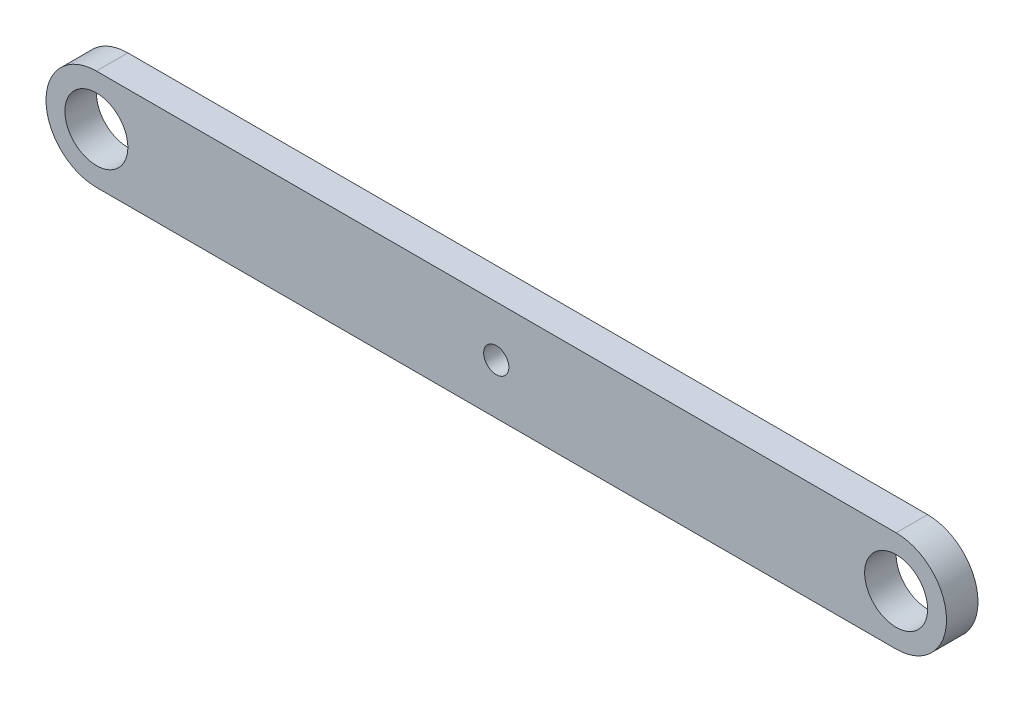
ISO-10303-21;
HEADER;
FILE_DESCRIPTION(('STEP AP214'),'2;1');
FILE_NAME('part.step','',(''),(''),'','','');
FILE_SCHEMA(('AUTOMOTIVE_DESIGN { 1 0 10303 214 1 1 1 1 }'));
ENDSEC;
DATA;
#1=APPLICATION_CONTEXT('core data for automotive mechanical design processes');
#2=APPLICATION_PROTOCOL_DEFINITION('international standard','automotive_design',2000,#1);
#3=PRODUCT_CONTEXT('',#1,'mechanical');
#4=PRODUCT('Part','Part','',(#3));
#5=PRODUCT_RELATED_PRODUCT_CATEGORY('part','',(#4));
#6=PRODUCT_DEFINITION_FORMATION('','',#4);
#7=PRODUCT_DEFINITION_CONTEXT('part definition',#1,'design');
#8=PRODUCT_DEFINITION('design','',#6,#7);
#9=PRODUCT_DEFINITION_SHAPE('','',#8);
#10=(LENGTH_UNIT() NAMED_UNIT(*) SI_UNIT(.MILLI.,.METRE.));
#11=(NAMED_UNIT(*) PLANE_ANGLE_UNIT() SI_UNIT($,.RADIAN.));
#12=(NAMED_UNIT(*) SI_UNIT($,.STERADIAN.) SOLID_ANGLE_UNIT());
#13=UNCERTAINTY_MEASURE_WITH_UNIT(LENGTH_MEASURE(1.E-05),#10,'distance_accuracy_value','');
#14=(GEOMETRIC_REPRESENTATION_CONTEXT(3) GLOBAL_UNCERTAINTY_ASSIGNED_CONTEXT((#13)) GLOBAL_UNIT_ASSIGNED_CONTEXT((#10,
#11,#12)) REPRESENTATION_CONTEXT('',''));
#15=CARTESIAN_POINT('',(0.,0.,0.));
#16=DIRECTION('',(0.,0.,1.));
#17=DIRECTION('',(1.,0.,0.));
#18=AXIS2_PLACEMENT_3D('',#15,#16,#17);
#19=CARTESIAN_POINT('',(-63.5,0.,2.5));
#20=DIRECTION('',(0.,0.,1.));
#21=DIRECTION('',(1.,0.,0.));
#22=AXIS2_PLACEMENT_3D('',#19,#20,#21);
#23=PLANE('',#22);
#24=CARTESIAN_POINT('',(63.5,0.,2.5));
#25=DIRECTION('',(0.,0.,1.));
#26=DIRECTION('',(1.,0.,0.));
#27=AXIS2_PLACEMENT_3D('',#24,#25,#26);
#28=CIRCLE('',#27,5.);
#29=CARTESIAN_POINT('',(68.5,0.,2.5));
#30=VERTEX_POINT('',#29);
#31=EDGE_CURVE('E119',#30,#30,#28,.T.);
#32=ORIENTED_EDGE('',*,*,#31,.F.);
#33=EDGE_LOOP('',(#32));
#34=FACE_BOUND('',#33,.T.);
#35=CARTESIAN_POINT('',(-63.5,0.,2.5));
#36=DIRECTION('',(0.,0.,1.));
#37=DIRECTION('',(1.,0.,0.));
#38=AXIS2_PLACEMENT_3D('',#35,#36,#37);
#39=CIRCLE('',#38,8.);
#40=CARTESIAN_POINT('',(-63.5,8.,2.5));
#41=VERTEX_POINT('',#40);
#42=CARTESIAN_POINT('',(-63.5,-8.,2.5));
#43=VERTEX_POINT('',#42);
#44=EDGE_CURVE('E89',#41,#43,#39,.T.);
#45=ORIENTED_EDGE('',*,*,#44,.T.);
#46=DIRECTION('',(1.,0.,0.));
#47=VECTOR('',#46,1.);
#48=CARTESIAN_POINT('',(-63.5,-8.,2.5));
#49=LINE('',#48,#47);
#50=CARTESIAN_POINT('',(63.5,-8.,2.5));
#51=VERTEX_POINT('',#50);
#52=EDGE_CURVE('E84',#43,#51,#49,.T.);
#53=ORIENTED_EDGE('',*,*,#52,.T.);
#54=CARTESIAN_POINT('',(63.5,0.,2.5));
#55=DIRECTION('',(0.,0.,1.));
#56=DIRECTION('',(1.,0.,0.));
#57=AXIS2_PLACEMENT_3D('',#54,#55,#56);
#58=CIRCLE('',#57,8.);
#59=CARTESIAN_POINT('',(63.5,8.00000000000002,2.5));
#60=VERTEX_POINT('',#59);
#61=EDGE_CURVE('E87',#51,#60,#58,.T.);
#62=ORIENTED_EDGE('',*,*,#61,.T.);
#63=DIRECTION('',(-1.,0.,0.));
#64=VECTOR('',#63,1.);
#65=CARTESIAN_POINT('',(-63.5,8.,2.5));
#66=LINE('',#65,#64);
#67=EDGE_CURVE('E54',#60,#41,#66,.T.);
#68=ORIENTED_EDGE('',*,*,#67,.T.);
#69=EDGE_LOOP('',(#45,#53,#62,#68));
#70=FACE_BOUND('',#69,.T.);
#71=CARTESIAN_POINT('',(-63.5,0.,2.5));
#72=DIRECTION('',(0.,0.,1.));
#73=DIRECTION('',(1.,0.,0.));
#74=AXIS2_PLACEMENT_3D('',#71,#72,#73);
#75=CIRCLE('',#74,5.);
#76=CARTESIAN_POINT('',(-58.5,0.,2.5));
#77=VERTEX_POINT('',#76);
#78=EDGE_CURVE('E104',#77,#77,#75,.T.);
#79=ORIENTED_EDGE('',*,*,#78,.F.);
#80=EDGE_LOOP('',(#79));
#81=FACE_BOUND('',#80,.T.);
#82=CARTESIAN_POINT('',(0.,0.,2.5));
#83=DIRECTION('',(0.,0.,1.));
#84=DIRECTION('',(1.,0.,0.));
#85=AXIS2_PLACEMENT_3D('',#82,#83,#84);
#86=CIRCLE('',#85,2.);
#87=CARTESIAN_POINT('',(2.,0.,2.5));
#88=VERTEX_POINT('',#87);
#89=EDGE_CURVE('E125',#88,#88,#86,.T.);
#90=ORIENTED_EDGE('',*,*,#89,.F.);
#91=EDGE_LOOP('',(#90));
#92=FACE_BOUND('',#91,.T.);
#93=ADVANCED_FACE('F37',(#34,#70,#81,#92),#23,.T.);
#94=CARTESIAN_POINT('',(-63.5,0.,-2.5));
#95=DIRECTION('',(0.,0.,1.));
#96=DIRECTION('',(1.,0.,0.));
#97=AXIS2_PLACEMENT_3D('',#94,#95,#96);
#98=PLANE('',#97);
#99=CARTESIAN_POINT('',(-63.5,0.,-2.5));
#100=DIRECTION('',(0.,0.,1.));
#101=DIRECTION('',(1.,0.,0.));
#102=AXIS2_PLACEMENT_3D('',#99,#100,#101);
#103=CIRCLE('',#102,8.);
#104=CARTESIAN_POINT('',(-63.5,8.,-2.5));
#105=VERTEX_POINT('',#104);
#106=CARTESIAN_POINT('',(-63.5,-8.,-2.5));
#107=VERTEX_POINT('',#106);
#108=EDGE_CURVE('E101',#105,#107,#103,.T.);
#109=ORIENTED_EDGE('',*,*,#108,.F.);
#110=DIRECTION('',(-1.,0.,0.));
#111=VECTOR('',#110,1.);
#112=CARTESIAN_POINT('',(-63.5,8.,-2.5));
#113=LINE('',#112,#111);
#114=CARTESIAN_POINT('',(63.5,8.00000000000002,-2.5));
#115=VERTEX_POINT('',#114);
#116=EDGE_CURVE('E77',#115,#105,#113,.T.);
#117=ORIENTED_EDGE('',*,*,#116,.F.);
#118=CARTESIAN_POINT('',(63.5,0.,-2.5));
#119=DIRECTION('',(0.,0.,1.));
#120=DIRECTION('',(1.,0.,0.));
#121=AXIS2_PLACEMENT_3D('',#118,#119,#120);
#122=CIRCLE('',#121,8.);
#123=CARTESIAN_POINT('',(63.5,-8.,-2.5));
#124=VERTEX_POINT('',#123);
#125=EDGE_CURVE('E71',#124,#115,#122,.T.);
#126=ORIENTED_EDGE('',*,*,#125,.F.);
#127=DIRECTION('',(1.,0.,0.));
#128=VECTOR('',#127,1.);
#129=CARTESIAN_POINT('',(-63.5,-8.,-2.5));
#130=LINE('',#129,#128);
#131=EDGE_CURVE('E93',#107,#124,#130,.T.);
#132=ORIENTED_EDGE('',*,*,#131,.F.);
#133=EDGE_LOOP('',(#109,#117,#126,#132));
#134=FACE_BOUND('',#133,.T.);
#135=CARTESIAN_POINT('',(-63.5,0.,-2.5));
#136=DIRECTION('',(0.,0.,1.));
#137=DIRECTION('',(1.,0.,0.));
#138=AXIS2_PLACEMENT_3D('',#135,#136,#137);
#139=CIRCLE('',#138,5.);
#140=CARTESIAN_POINT('',(-58.5,0.,-2.5));
#141=VERTEX_POINT('',#140);
#142=EDGE_CURVE('E116',#141,#141,#139,.T.);
#143=ORIENTED_EDGE('',*,*,#142,.T.);
#144=EDGE_LOOP('',(#143));
#145=FACE_BOUND('',#144,.T.);
#146=CARTESIAN_POINT('',(63.5,0.,-2.5));
#147=DIRECTION('',(0.,0.,1.));
#148=DIRECTION('',(1.,0.,0.));
#149=AXIS2_PLACEMENT_3D('',#146,#147,#148);
#150=CIRCLE('',#149,5.);
#151=CARTESIAN_POINT('',(68.5,0.,-2.5));
#152=VERTEX_POINT('',#151);
#153=EDGE_CURVE('E122',#152,#152,#150,.T.);
#154=ORIENTED_EDGE('',*,*,#153,.T.);
#155=EDGE_LOOP('',(#154));
#156=FACE_BOUND('',#155,.T.);
#157=CARTESIAN_POINT('',(0.,0.,-2.5));
#158=DIRECTION('',(0.,0.,1.));
#159=DIRECTION('',(1.,0.,0.));
#160=AXIS2_PLACEMENT_3D('',#157,#158,#159);
#161=CIRCLE('',#160,2.);
#162=CARTESIAN_POINT('',(2.,0.,-2.5));
#163=VERTEX_POINT('',#162);
#164=EDGE_CURVE('E128',#163,#163,#161,.T.);
#165=ORIENTED_EDGE('',*,*,#164,.T.);
#166=EDGE_LOOP('',(#165));
#167=FACE_BOUND('',#166,.T.);
#168=ADVANCED_FACE('F112',(#134,#145,#156,#167),#98,.F.);
#169=CARTESIAN_POINT('',(-63.5,0.,2.5));
#170=DIRECTION('',(0.,0.,-1.));
#171=DIRECTION('',(-1.,0.,0.));
#172=AXIS2_PLACEMENT_3D('',#169,#170,#171);
#173=CYLINDRICAL_SURFACE('',#172,8.);
#174=ORIENTED_EDGE('',*,*,#108,.T.);
#175=DIRECTION('',(0.,0.,-1.));
#176=VECTOR('',#175,1.);
#177=CARTESIAN_POINT('',(-63.5,-8.,2.5));
#178=LINE('',#177,#176);
#179=EDGE_CURVE('E11',#43,#107,#178,.T.);
#180=ORIENTED_EDGE('',*,*,#179,.F.);
#181=ORIENTED_EDGE('',*,*,#44,.F.);
#182=DIRECTION('',(0.,0.,-1.));
#183=VECTOR('',#182,1.);
#184=CARTESIAN_POINT('',(-63.5,8.,2.5));
#185=LINE('',#184,#183);
#186=EDGE_CURVE('E97',#41,#105,#185,.T.);
#187=ORIENTED_EDGE('',*,*,#186,.T.);
#188=EDGE_LOOP('',(#174,#180,#181,#187));
#189=FACE_BOUND('',#188,.T.);
#190=ADVANCED_FACE('F39',(#189),#173,.T.);
#191=CARTESIAN_POINT('',(-63.5,-8.,2.5));
#192=DIRECTION('',(0.,1.,0.));
#193=DIRECTION('',(-1.,0.,0.));
#194=AXIS2_PLACEMENT_3D('',#191,#192,#193);
#195=PLANE('',#194);
#196=ORIENTED_EDGE('',*,*,#131,.T.);
#197=DIRECTION('',(0.,0.,-1.));
#198=VECTOR('',#197,1.);
#199=CARTESIAN_POINT('',(63.5,-8.,2.5));
#200=LINE('',#199,#198);
#201=EDGE_CURVE('E46',#51,#124,#200,.T.);
#202=ORIENTED_EDGE('',*,*,#201,.F.);
#203=ORIENTED_EDGE('',*,*,#52,.F.);
#204=ORIENTED_EDGE('',*,*,#179,.T.);
#205=EDGE_LOOP('',(#196,#202,#203,#204));
#206=FACE_BOUND('',#205,.T.);
#207=ADVANCED_FACE('F92',(#206),#195,.F.);
#208=CARTESIAN_POINT('',(63.5,0.,2.5));
#209=DIRECTION('',(0.,0.,-1.));
#210=DIRECTION('',(-1.,0.,0.));
#211=AXIS2_PLACEMENT_3D('',#208,#209,#210);
#212=CYLINDRICAL_SURFACE('',#211,8.);
#213=ORIENTED_EDGE('',*,*,#125,.T.);
#214=DIRECTION('',(0.,0.,-1.));
#215=VECTOR('',#214,1.);
#216=CARTESIAN_POINT('',(63.5,8.00000000000002,2.5));
#217=LINE('',#216,#215);
#218=EDGE_CURVE('E94',#60,#115,#217,.T.);
#219=ORIENTED_EDGE('',*,*,#218,.F.);
#220=ORIENTED_EDGE('',*,*,#61,.F.);
#221=ORIENTED_EDGE('',*,*,#201,.T.);
#222=EDGE_LOOP('',(#213,#219,#220,#221));
#223=FACE_BOUND('',#222,.T.);
#224=ADVANCED_FACE('F95',(#223),#212,.T.);
#225=CARTESIAN_POINT('',(-63.5,8.,2.5));
#226=DIRECTION('',(0.,-1.,0.));
#227=DIRECTION('',(1.,0.,0.));
#228=AXIS2_PLACEMENT_3D('',#225,#226,#227);
#229=PLANE('',#228);
#230=ORIENTED_EDGE('',*,*,#116,.T.);
#231=ORIENTED_EDGE('',*,*,#186,.F.);
#232=ORIENTED_EDGE('',*,*,#67,.F.);
#233=ORIENTED_EDGE('',*,*,#218,.T.);
#234=EDGE_LOOP('',(#230,#231,#232,#233));
#235=FACE_BOUND('',#234,.T.);
#236=ADVANCED_FACE('F109',(#235),#229,.F.);
#237=CARTESIAN_POINT('',(-63.5,0.,2.5));
#238=DIRECTION('',(0.,0.,-1.));
#239=DIRECTION('',(-1.,0.,0.));
#240=AXIS2_PLACEMENT_3D('',#237,#238,#239);
#241=CYLINDRICAL_SURFACE('',#240,5.);
#242=ORIENTED_EDGE('',*,*,#78,.T.);
#243=EDGE_LOOP('',(#242));
#244=FACE_BOUND('',#243,.T.);
#245=ORIENTED_EDGE('',*,*,#142,.F.);
#246=EDGE_LOOP('',(#245));
#247=FACE_BOUND('',#246,.T.);
#248=ADVANCED_FACE('F146',(#244,#247),#241,.F.);
#249=CARTESIAN_POINT('',(63.5,0.,2.5));
#250=DIRECTION('',(0.,0.,-1.));
#251=DIRECTION('',(-1.,0.,0.));
#252=AXIS2_PLACEMENT_3D('',#249,#250,#251);
#253=CYLINDRICAL_SURFACE('',#252,5.);
#254=ORIENTED_EDGE('',*,*,#31,.T.);
#255=EDGE_LOOP('',(#254));
#256=FACE_BOUND('',#255,.T.);
#257=ORIENTED_EDGE('',*,*,#153,.F.);
#258=EDGE_LOOP('',(#257));
#259=FACE_BOUND('',#258,.T.);
#260=ADVANCED_FACE('F192',(#256,#259),#253,.F.);
#261=CARTESIAN_POINT('',(0.,0.,2.5));
#262=DIRECTION('',(0.,0.,-1.));
#263=DIRECTION('',(-1.,0.,0.));
#264=AXIS2_PLACEMENT_3D('',#261,#262,#263);
#265=CYLINDRICAL_SURFACE('',#264,2.);
#266=ORIENTED_EDGE('',*,*,#89,.T.);
#267=EDGE_LOOP('',(#266));
#268=FACE_BOUND('',#267,.T.);
#269=ORIENTED_EDGE('',*,*,#164,.F.);
#270=EDGE_LOOP('',(#269));
#271=FACE_BOUND('',#270,.T.);
#272=ADVANCED_FACE('F134',(#268,#271),#265,.F.);
#273=CLOSED_SHELL('',(#93,#168,#190,#207,#224,#236,#248,#260,#272));
#274=MANIFOLD_SOLID_BREP('B2',#273);
#275=ADVANCED_BREP_SHAPE_REPRESENTATION('',(#18,#274),#14);
#276=SHAPE_DEFINITION_REPRESENTATION(#9,#275);
ENDSEC;
END-ISO-10303-21;
